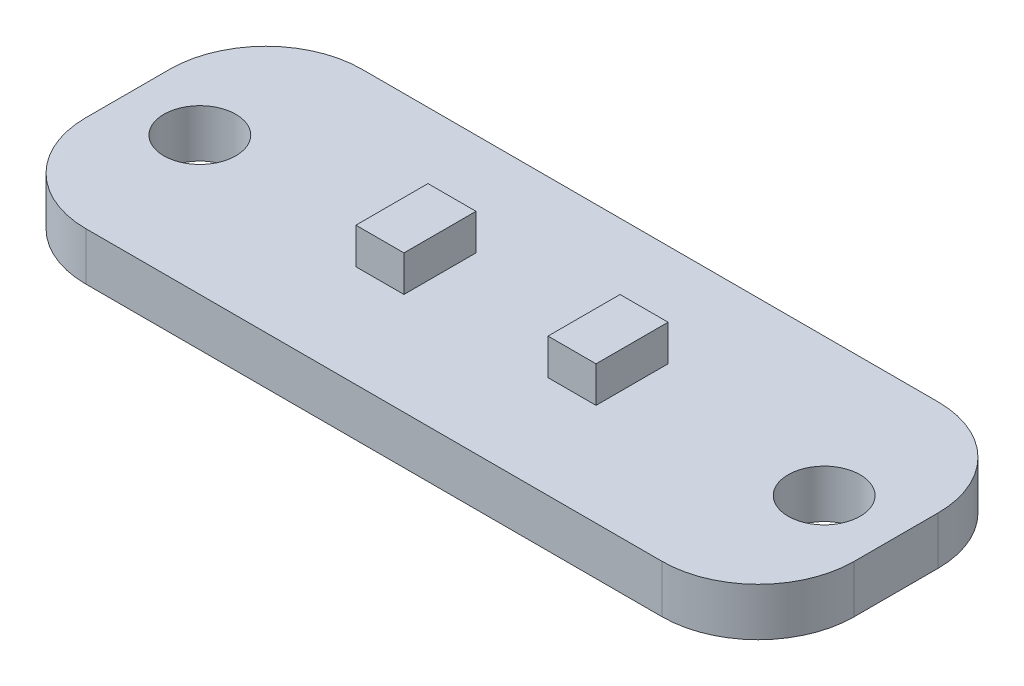
ISO-10303-21;
HEADER;
FILE_DESCRIPTION(('STEP AP214'),'2;1');
FILE_NAME('part.step','',(''),(''),'','','');
FILE_SCHEMA(('AUTOMOTIVE_DESIGN { 1 0 10303 214 1 1 1 1 }'));
ENDSEC;
DATA;
#1=APPLICATION_CONTEXT('core data for automotive mechanical design processes');
#2=APPLICATION_PROTOCOL_DEFINITION('international standard','automotive_design',2000,#1);
#3=PRODUCT_CONTEXT('',#1,'mechanical');
#4=PRODUCT('Part','Part','',(#3));
#5=PRODUCT_RELATED_PRODUCT_CATEGORY('part','',(#4));
#6=PRODUCT_DEFINITION_FORMATION('','',#4);
#7=PRODUCT_DEFINITION_CONTEXT('part definition',#1,'design');
#8=PRODUCT_DEFINITION('design','',#6,#7);
#9=PRODUCT_DEFINITION_SHAPE('','',#8);
#10=(LENGTH_UNIT() NAMED_UNIT(*) SI_UNIT(.MILLI.,.METRE.));
#11=(NAMED_UNIT(*) PLANE_ANGLE_UNIT() SI_UNIT($,.RADIAN.));
#12=(NAMED_UNIT(*) SI_UNIT($,.STERADIAN.) SOLID_ANGLE_UNIT());
#13=UNCERTAINTY_MEASURE_WITH_UNIT(LENGTH_MEASURE(1.E-05),#10,'distance_accuracy_value','');
#14=(GEOMETRIC_REPRESENTATION_CONTEXT(3) GLOBAL_UNCERTAINTY_ASSIGNED_CONTEXT((#13)) GLOBAL_UNIT_ASSIGNED_CONTEXT((#10,
#11,#12)) REPRESENTATION_CONTEXT('',''));
#15=CARTESIAN_POINT('',(0.,0.,0.));
#16=DIRECTION('',(0.,0.,1.));
#17=DIRECTION('',(1.,0.,0.));
#18=AXIS2_PLACEMENT_3D('',#15,#16,#17);
#19=CARTESIAN_POINT('',(0.,2.,0.));
#20=DIRECTION('',(1.,0.,0.));
#21=DIRECTION('',(0.,0.,-1.));
#22=AXIS2_PLACEMENT_3D('',#19,#20,#21);
#23=PLANE('',#22);
#24=DIRECTION('',(0.,0.,1.));
#25=VECTOR('',#24,1.);
#26=CARTESIAN_POINT('',(0.,2.,0.));
#27=LINE('',#26,#25);
#28=CARTESIAN_POINT('',(0.,2.,4.));
#29=VERTEX_POINT('',#28);
#30=CARTESIAN_POINT('',(0.,2.,7.5));
#31=VERTEX_POINT('',#30);
#32=EDGE_CURVE('E224',#29,#31,#27,.T.);
#33=ORIENTED_EDGE('',*,*,#32,.F.);
#34=DIRECTION('',(0.,-1.,0.));
#35=VECTOR('',#34,1.);
#36=CARTESIAN_POINT('',(0.,2.,4.));
#37=LINE('',#36,#35);
#38=CARTESIAN_POINT('',(0.,0.,4.));
#39=VERTEX_POINT('',#38);
#40=EDGE_CURVE('E11',#29,#39,#37,.T.);
#41=ORIENTED_EDGE('',*,*,#40,.T.);
#42=DIRECTION('',(0.,0.,1.));
#43=VECTOR('',#42,1.);
#44=CARTESIAN_POINT('',(0.,0.,0.));
#45=LINE('',#44,#43);
#46=CARTESIAN_POINT('',(0.,0.,7.5));
#47=VERTEX_POINT('',#46);
#48=EDGE_CURVE('E220',#39,#47,#45,.T.);
#49=ORIENTED_EDGE('',*,*,#48,.T.);
#50=DIRECTION('',(0.,-1.,0.));
#51=VECTOR('',#50,1.);
#52=CARTESIAN_POINT('',(0.,2.,7.5));
#53=LINE('',#52,#51);
#54=EDGE_CURVE('E50',#47,#31,#53,.F.);
#55=ORIENTED_EDGE('',*,*,#54,.T.);
#56=EDGE_LOOP('',(#33,#41,#49,#55));
#57=FACE_BOUND('',#56,.T.);
#58=ADVANCED_FACE('F39',(#57),#23,.F.);
#59=CARTESIAN_POINT('',(0.,2.,11.5));
#60=DIRECTION('',(0.,0.,-1.));
#61=DIRECTION('',(-1.,0.,0.));
#62=AXIS2_PLACEMENT_3D('',#59,#60,#61);
#63=PLANE('',#62);
#64=DIRECTION('',(1.,0.,0.));
#65=VECTOR('',#64,1.);
#66=CARTESIAN_POINT('',(0.,0.,11.5));
#67=LINE('',#66,#65);
#68=CARTESIAN_POINT('',(4.,0.,11.5));
#69=VERTEX_POINT('',#68);
#70=CARTESIAN_POINT('',(28.,0.,11.5));
#71=VERTEX_POINT('',#70);
#72=EDGE_CURVE('E239',#69,#71,#67,.T.);
#73=ORIENTED_EDGE('',*,*,#72,.T.);
#74=DIRECTION('',(0.,-1.,0.));
#75=VECTOR('',#74,1.);
#76=CARTESIAN_POINT('',(28.,2.,11.5));
#77=LINE('',#76,#75);
#78=CARTESIAN_POINT('',(28.,2.,11.5));
#79=VERTEX_POINT('',#78);
#80=EDGE_CURVE('E274',#71,#79,#77,.F.);
#81=ORIENTED_EDGE('',*,*,#80,.T.);
#82=DIRECTION('',(1.,0.,0.));
#83=VECTOR('',#82,1.);
#84=CARTESIAN_POINT('',(0.,2.,11.5));
#85=LINE('',#84,#83);
#86=CARTESIAN_POINT('',(4.,2.,11.5));
#87=VERTEX_POINT('',#86);
#88=EDGE_CURVE('E226',#87,#79,#85,.T.);
#89=ORIENTED_EDGE('',*,*,#88,.F.);
#90=DIRECTION('',(0.,-1.,0.));
#91=VECTOR('',#90,1.);
#92=CARTESIAN_POINT('',(4.,2.,11.5));
#93=LINE('',#92,#91);
#94=EDGE_CURVE('E275',#87,#69,#93,.T.);
#95=ORIENTED_EDGE('',*,*,#94,.T.);
#96=EDGE_LOOP('',(#73,#81,#89,#95));
#97=FACE_BOUND('',#96,.T.);
#98=ADVANCED_FACE('F286',(#97),#63,.F.);
#99=CARTESIAN_POINT('',(32.,2.,0.));
#100=DIRECTION('',(-1.,0.,0.));
#101=DIRECTION('',(0.,0.,1.));
#102=AXIS2_PLACEMENT_3D('',#99,#100,#101);
#103=PLANE('',#102);
#104=DIRECTION('',(0.,0.,-1.));
#105=VECTOR('',#104,1.);
#106=CARTESIAN_POINT('',(32.,0.,0.));
#107=LINE('',#106,#105);
#108=CARTESIAN_POINT('',(32.,0.,7.5));
#109=VERTEX_POINT('',#108);
#110=CARTESIAN_POINT('',(32.,0.,4.));
#111=VERTEX_POINT('',#110);
#112=EDGE_CURVE('E245',#109,#111,#107,.T.);
#113=ORIENTED_EDGE('',*,*,#112,.T.);
#114=DIRECTION('',(0.,-1.,0.));
#115=VECTOR('',#114,1.);
#116=CARTESIAN_POINT('',(32.,2.,4.));
#117=LINE('',#116,#115);
#118=CARTESIAN_POINT('',(32.,2.,4.));
#119=VERTEX_POINT('',#118);
#120=EDGE_CURVE('E265',#111,#119,#117,.F.);
#121=ORIENTED_EDGE('',*,*,#120,.T.);
#122=DIRECTION('',(0.,0.,-1.));
#123=VECTOR('',#122,1.);
#124=CARTESIAN_POINT('',(32.,2.,0.));
#125=LINE('',#124,#123);
#126=CARTESIAN_POINT('',(32.,2.,7.5));
#127=VERTEX_POINT('',#126);
#128=EDGE_CURVE('E229',#127,#119,#125,.T.);
#129=ORIENTED_EDGE('',*,*,#128,.F.);
#130=DIRECTION('',(0.,-1.,0.));
#131=VECTOR('',#130,1.);
#132=CARTESIAN_POINT('',(32.,2.,7.5));
#133=LINE('',#132,#131);
#134=EDGE_CURVE('E259',#127,#109,#133,.T.);
#135=ORIENTED_EDGE('',*,*,#134,.T.);
#136=EDGE_LOOP('',(#113,#121,#129,#135));
#137=FACE_BOUND('',#136,.T.);
#138=ADVANCED_FACE('F305',(#137),#103,.F.);
#139=CARTESIAN_POINT('',(0.,2.,0.));
#140=DIRECTION('',(0.,0.,1.));
#141=DIRECTION('',(1.,0.,0.));
#142=AXIS2_PLACEMENT_3D('',#139,#140,#141);
#143=PLANE('',#142);
#144=DIRECTION('',(-1.,0.,0.));
#145=VECTOR('',#144,1.);
#146=CARTESIAN_POINT('',(0.,2.,0.));
#147=LINE('',#146,#145);
#148=CARTESIAN_POINT('',(28.,2.,0.));
#149=VERTEX_POINT('',#148);
#150=CARTESIAN_POINT('',(4.,2.,0.));
#151=VERTEX_POINT('',#150);
#152=EDGE_CURVE('E233',#149,#151,#147,.T.);
#153=ORIENTED_EDGE('',*,*,#152,.F.);
#154=DIRECTION('',(0.,-1.,0.));
#155=VECTOR('',#154,1.);
#156=CARTESIAN_POINT('',(28.,2.,0.));
#157=LINE('',#156,#155);
#158=CARTESIAN_POINT('',(28.,0.,0.));
#159=VERTEX_POINT('',#158);
#160=EDGE_CURVE('E248',#149,#159,#157,.T.);
#161=ORIENTED_EDGE('',*,*,#160,.T.);
#162=DIRECTION('',(-1.,0.,0.));
#163=VECTOR('',#162,1.);
#164=CARTESIAN_POINT('',(0.,0.,0.));
#165=LINE('',#164,#163);
#166=CARTESIAN_POINT('',(4.,0.,0.));
#167=VERTEX_POINT('',#166);
#168=EDGE_CURVE('E230',#159,#167,#165,.T.);
#169=ORIENTED_EDGE('',*,*,#168,.T.);
#170=DIRECTION('',(0.,-1.,0.));
#171=VECTOR('',#170,1.);
#172=CARTESIAN_POINT('',(4.,2.,0.));
#173=LINE('',#172,#171);
#174=EDGE_CURVE('E237',#167,#151,#173,.F.);
#175=ORIENTED_EDGE('',*,*,#174,.T.);
#176=EDGE_LOOP('',(#153,#161,#169,#175));
#177=FACE_BOUND('',#176,.T.);
#178=ADVANCED_FACE('F309',(#177),#143,.F.);
#179=CARTESIAN_POINT('',(0.,2.,0.));
#180=DIRECTION('',(0.,1.,0.));
#181=DIRECTION('',(0.,0.,1.));
#182=AXIS2_PLACEMENT_3D('',#179,#180,#181);
#183=PLANE('',#182);
#184=DIRECTION('',(0.,0.,1.));
#185=VECTOR('',#184,1.);
#186=CARTESIAN_POINT('',(11.,2.,4.25));
#187=LINE('',#186,#185);
#188=CARTESIAN_POINT('',(11.,2.,4.25));
#189=VERTEX_POINT('',#188);
#190=CARTESIAN_POINT('',(11.,2.,7.25));
#191=VERTEX_POINT('',#190);
#192=EDGE_CURVE('E53',#189,#191,#187,.T.);
#193=ORIENTED_EDGE('',*,*,#192,.F.);
#194=DIRECTION('',(-1.,0.,0.));
#195=VECTOR('',#194,1.);
#196=CARTESIAN_POINT('',(11.,2.,4.25));
#197=LINE('',#196,#195);
#198=CARTESIAN_POINT('',(13.,2.,4.25));
#199=VERTEX_POINT('',#198);
#200=EDGE_CURVE('E59',#199,#189,#197,.T.);
#201=ORIENTED_EDGE('',*,*,#200,.F.);
#202=DIRECTION('',(0.,0.,-1.));
#203=VECTOR('',#202,1.);
#204=CARTESIAN_POINT('',(13.,2.,4.25));
#205=LINE('',#204,#203);
#206=CARTESIAN_POINT('',(13.,2.,7.25));
#207=VERTEX_POINT('',#206);
#208=EDGE_CURVE('E498',#207,#199,#205,.T.);
#209=ORIENTED_EDGE('',*,*,#208,.F.);
#210=DIRECTION('',(1.,0.,0.));
#211=VECTOR('',#210,1.);
#212=CARTESIAN_POINT('',(11.,2.,7.25));
#213=LINE('',#212,#211);
#214=EDGE_CURVE('E507',#191,#207,#213,.T.);
#215=ORIENTED_EDGE('',*,*,#214,.F.);
#216=EDGE_LOOP('',(#193,#201,#209,#215));
#217=FACE_BOUND('',#216,.T.);
#218=DIRECTION('',(0.,0.,1.));
#219=VECTOR('',#218,1.);
#220=CARTESIAN_POINT('',(19.,2.,4.25));
#221=LINE('',#220,#219);
#222=CARTESIAN_POINT('',(19.,2.,4.25));
#223=VERTEX_POINT('',#222);
#224=CARTESIAN_POINT('',(19.,2.,7.25));
#225=VERTEX_POINT('',#224);
#226=EDGE_CURVE('E204',#223,#225,#221,.T.);
#227=ORIENTED_EDGE('',*,*,#226,.F.);
#228=DIRECTION('',(-1.,0.,0.));
#229=VECTOR('',#228,1.);
#230=CARTESIAN_POINT('',(19.,2.,4.25));
#231=LINE('',#230,#229);
#232=CARTESIAN_POINT('',(21.,2.,4.25));
#233=VERTEX_POINT('',#232);
#234=EDGE_CURVE('E194',#233,#223,#231,.T.);
#235=ORIENTED_EDGE('',*,*,#234,.F.);
#236=DIRECTION('',(0.,0.,-1.));
#237=VECTOR('',#236,1.);
#238=CARTESIAN_POINT('',(21.,2.,4.25));
#239=LINE('',#238,#237);
#240=CARTESIAN_POINT('',(21.,2.,7.25));
#241=VERTEX_POINT('',#240);
#242=EDGE_CURVE('E197',#241,#233,#239,.T.);
#243=ORIENTED_EDGE('',*,*,#242,.F.);
#244=DIRECTION('',(1.,0.,0.));
#245=VECTOR('',#244,1.);
#246=CARTESIAN_POINT('',(19.,2.,7.25));
#247=LINE('',#246,#245);
#248=EDGE_CURVE('E203',#225,#241,#247,.T.);
#249=ORIENTED_EDGE('',*,*,#248,.F.);
#250=EDGE_LOOP('',(#227,#235,#243,#249));
#251=FACE_BOUND('',#250,.T.);
#252=CARTESIAN_POINT('',(3.,2.,5.75));
#253=DIRECTION('',(0.,1.,0.));
#254=DIRECTION('',(0.,0.,1.));
#255=AXIS2_PLACEMENT_3D('',#252,#253,#254);
#256=CIRCLE('',#255,1.5);
#257=CARTESIAN_POINT('',(3.,2.,7.25));
#258=VERTEX_POINT('',#257);
#259=EDGE_CURVE('E217',#258,#258,#256,.T.);
#260=ORIENTED_EDGE('',*,*,#259,.F.);
#261=EDGE_LOOP('',(#260));
#262=FACE_BOUND('',#261,.T.);
#263=CARTESIAN_POINT('',(29.,2.,5.75));
#264=DIRECTION('',(0.,1.,0.));
#265=DIRECTION('',(0.,0.,1.));
#266=AXIS2_PLACEMENT_3D('',#263,#264,#265);
#267=CIRCLE('',#266,1.5);
#268=CARTESIAN_POINT('',(29.,2.,7.25));
#269=VERTEX_POINT('',#268);
#270=EDGE_CURVE('E174',#269,#269,#267,.T.);
#271=ORIENTED_EDGE('',*,*,#270,.F.);
#272=EDGE_LOOP('',(#271));
#273=FACE_BOUND('',#272,.T.);
#274=ORIENTED_EDGE('',*,*,#128,.T.);
#275=CARTESIAN_POINT('',(28.,2.,4.));
#276=DIRECTION('',(0.,1.,0.));
#277=DIRECTION('',(0.,0.,1.));
#278=AXIS2_PLACEMENT_3D('',#275,#276,#277);
#279=CIRCLE('',#278,4.);
#280=EDGE_CURVE('E269',#119,#149,#279,.T.);
#281=ORIENTED_EDGE('',*,*,#280,.T.);
#282=ORIENTED_EDGE('',*,*,#152,.T.);
#283=CARTESIAN_POINT('',(4.,2.,4.));
#284=DIRECTION('',(0.,1.,0.));
#285=DIRECTION('',(0.,0.,1.));
#286=AXIS2_PLACEMENT_3D('',#283,#284,#285);
#287=CIRCLE('',#286,4.);
#288=EDGE_CURVE('E266',#151,#29,#287,.T.);
#289=ORIENTED_EDGE('',*,*,#288,.T.);
#290=ORIENTED_EDGE('',*,*,#32,.T.);
#291=CARTESIAN_POINT('',(4.,2.,7.5));
#292=DIRECTION('',(0.,1.,0.));
#293=DIRECTION('',(0.,0.,1.));
#294=AXIS2_PLACEMENT_3D('',#291,#292,#293);
#295=CIRCLE('',#294,4.);
#296=EDGE_CURVE('E262',#31,#87,#295,.T.);
#297=ORIENTED_EDGE('',*,*,#296,.T.);
#298=ORIENTED_EDGE('',*,*,#88,.T.);
#299=CARTESIAN_POINT('',(28.,2.,7.5));
#300=DIRECTION('',(0.,1.,0.));
#301=DIRECTION('',(0.,0.,1.));
#302=AXIS2_PLACEMENT_3D('',#299,#300,#301);
#303=CIRCLE('',#302,4.);
#304=EDGE_CURVE('E268',#79,#127,#303,.T.);
#305=ORIENTED_EDGE('',*,*,#304,.T.);
#306=EDGE_LOOP('',(#274,#281,#282,#289,#290,#297,#298,#305));
#307=FACE_BOUND('',#306,.T.);
#308=ADVANCED_FACE('F283',(#217,#251,#262,#273,#307),#183,.T.);
#309=CARTESIAN_POINT('',(0.,0.,0.));
#310=DIRECTION('',(0.,1.,0.));
#311=DIRECTION('',(0.,0.,1.));
#312=AXIS2_PLACEMENT_3D('',#309,#310,#311);
#313=PLANE('',#312);
#314=CARTESIAN_POINT('',(3.,0.,5.75));
#315=DIRECTION('',(0.,1.,0.));
#316=DIRECTION('',(0.,0.,1.));
#317=AXIS2_PLACEMENT_3D('',#314,#315,#316);
#318=CIRCLE('',#317,1.5);
#319=CARTESIAN_POINT('',(3.,0.,7.25));
#320=VERTEX_POINT('',#319);
#321=EDGE_CURVE('E212',#320,#320,#318,.T.);
#322=ORIENTED_EDGE('',*,*,#321,.T.);
#323=EDGE_LOOP('',(#322));
#324=FACE_BOUND('',#323,.T.);
#325=CARTESIAN_POINT('',(29.,0.,5.75));
#326=DIRECTION('',(0.,1.,0.));
#327=DIRECTION('',(0.,0.,1.));
#328=AXIS2_PLACEMENT_3D('',#325,#326,#327);
#329=CIRCLE('',#328,1.5);
#330=CARTESIAN_POINT('',(29.,0.,7.25));
#331=VERTEX_POINT('',#330);
#332=EDGE_CURVE('E175',#331,#331,#329,.T.);
#333=ORIENTED_EDGE('',*,*,#332,.T.);
#334=EDGE_LOOP('',(#333));
#335=FACE_BOUND('',#334,.T.);
#336=ORIENTED_EDGE('',*,*,#168,.F.);
#337=CARTESIAN_POINT('',(28.,0.,4.));
#338=DIRECTION('',(0.,1.,0.));
#339=DIRECTION('',(0.,0.,1.));
#340=AXIS2_PLACEMENT_3D('',#337,#338,#339);
#341=CIRCLE('',#340,4.);
#342=EDGE_CURVE('E260',#159,#111,#341,.F.);
#343=ORIENTED_EDGE('',*,*,#342,.T.);
#344=ORIENTED_EDGE('',*,*,#112,.F.);
#345=CARTESIAN_POINT('',(28.,0.,7.5));
#346=DIRECTION('',(0.,1.,0.));
#347=DIRECTION('',(0.,0.,1.));
#348=AXIS2_PLACEMENT_3D('',#345,#346,#347);
#349=CIRCLE('',#348,4.);
#350=EDGE_CURVE('E254',#109,#71,#349,.F.);
#351=ORIENTED_EDGE('',*,*,#350,.T.);
#352=ORIENTED_EDGE('',*,*,#72,.F.);
#353=CARTESIAN_POINT('',(4.,0.,7.5));
#354=DIRECTION('',(0.,1.,0.));
#355=DIRECTION('',(0.,0.,1.));
#356=AXIS2_PLACEMENT_3D('',#353,#354,#355);
#357=CIRCLE('',#356,4.);
#358=EDGE_CURVE('E253',#69,#47,#357,.F.);
#359=ORIENTED_EDGE('',*,*,#358,.T.);
#360=ORIENTED_EDGE('',*,*,#48,.F.);
#361=CARTESIAN_POINT('',(4.,0.,4.));
#362=DIRECTION('',(0.,1.,0.));
#363=DIRECTION('',(0.,0.,1.));
#364=AXIS2_PLACEMENT_3D('',#361,#362,#363);
#365=CIRCLE('',#364,4.);
#366=EDGE_CURVE('E251',#39,#167,#365,.F.);
#367=ORIENTED_EDGE('',*,*,#366,.T.);
#368=EDGE_LOOP('',(#336,#343,#344,#351,#352,#359,#360,#367));
#369=FACE_BOUND('',#368,.T.);
#370=ADVANCED_FACE('F294',(#324,#335,#369),#313,.F.);
#371=CARTESIAN_POINT('',(29.,0.,5.75));
#372=DIRECTION('',(0.,1.,0.));
#373=DIRECTION('',(0.,0.,1.));
#374=AXIS2_PLACEMENT_3D('',#371,#372,#373);
#375=CYLINDRICAL_SURFACE('',#374,1.5);
#376=ORIENTED_EDGE('',*,*,#332,.F.);
#377=EDGE_LOOP('',(#376));
#378=FACE_BOUND('',#377,.T.);
#379=ORIENTED_EDGE('',*,*,#270,.T.);
#380=EDGE_LOOP('',(#379));
#381=FACE_BOUND('',#380,.T.);
#382=ADVANCED_FACE('F333',(#378,#381),#375,.F.);
#383=CARTESIAN_POINT('',(3.,0.,5.75));
#384=DIRECTION('',(0.,1.,0.));
#385=DIRECTION('',(0.,0.,1.));
#386=AXIS2_PLACEMENT_3D('',#383,#384,#385);
#387=CYLINDRICAL_SURFACE('',#386,1.5);
#388=ORIENTED_EDGE('',*,*,#321,.F.);
#389=EDGE_LOOP('',(#388));
#390=FACE_BOUND('',#389,.T.);
#391=ORIENTED_EDGE('',*,*,#259,.T.);
#392=EDGE_LOOP('',(#391));
#393=FACE_BOUND('',#392,.T.);
#394=ADVANCED_FACE('F332',(#390,#393),#387,.F.);
#395=CARTESIAN_POINT('',(28.,2.,4.));
#396=DIRECTION('',(0.,-1.,0.));
#397=DIRECTION('',(0.,0.,-1.));
#398=AXIS2_PLACEMENT_3D('',#395,#396,#397);
#399=CYLINDRICAL_SURFACE('',#398,4.);
#400=ORIENTED_EDGE('',*,*,#280,.F.);
#401=ORIENTED_EDGE('',*,*,#120,.F.);
#402=ORIENTED_EDGE('',*,*,#342,.F.);
#403=ORIENTED_EDGE('',*,*,#160,.F.);
#404=EDGE_LOOP('',(#400,#401,#402,#403));
#405=FACE_BOUND('',#404,.T.);
#406=ADVANCED_FACE('F306',(#405),#399,.T.);
#407=CARTESIAN_POINT('',(28.,2.,7.5));
#408=DIRECTION('',(0.,-1.,0.));
#409=DIRECTION('',(0.,0.,-1.));
#410=AXIS2_PLACEMENT_3D('',#407,#408,#409);
#411=CYLINDRICAL_SURFACE('',#410,4.);
#412=ORIENTED_EDGE('',*,*,#304,.F.);
#413=ORIENTED_EDGE('',*,*,#80,.F.);
#414=ORIENTED_EDGE('',*,*,#350,.F.);
#415=ORIENTED_EDGE('',*,*,#134,.F.);
#416=EDGE_LOOP('',(#412,#413,#414,#415));
#417=FACE_BOUND('',#416,.T.);
#418=ADVANCED_FACE('F298',(#417),#411,.T.);
#419=CARTESIAN_POINT('',(4.,2.,4.));
#420=DIRECTION('',(0.,-1.,0.));
#421=DIRECTION('',(0.,0.,-1.));
#422=AXIS2_PLACEMENT_3D('',#419,#420,#421);
#423=CYLINDRICAL_SURFACE('',#422,4.);
#424=ORIENTED_EDGE('',*,*,#288,.F.);
#425=ORIENTED_EDGE('',*,*,#174,.F.);
#426=ORIENTED_EDGE('',*,*,#366,.F.);
#427=ORIENTED_EDGE('',*,*,#40,.F.);
#428=EDGE_LOOP('',(#424,#425,#426,#427));
#429=FACE_BOUND('',#428,.T.);
#430=ADVANCED_FACE('F311',(#429),#423,.T.);
#431=CARTESIAN_POINT('',(4.,2.,7.5));
#432=DIRECTION('',(0.,-1.,0.));
#433=DIRECTION('',(0.,0.,-1.));
#434=AXIS2_PLACEMENT_3D('',#431,#432,#433);
#435=CYLINDRICAL_SURFACE('',#434,4.);
#436=ORIENTED_EDGE('',*,*,#296,.F.);
#437=ORIENTED_EDGE('',*,*,#54,.F.);
#438=ORIENTED_EDGE('',*,*,#358,.F.);
#439=ORIENTED_EDGE('',*,*,#94,.F.);
#440=EDGE_LOOP('',(#436,#437,#438,#439));
#441=FACE_BOUND('',#440,.T.);
#442=ADVANCED_FACE('F41',(#441),#435,.T.);
#443=CARTESIAN_POINT('',(19.,3.5,4.25));
#444=DIRECTION('',(1.,0.,0.));
#445=DIRECTION('',(0.,0.,-1.));
#446=AXIS2_PLACEMENT_3D('',#443,#444,#445);
#447=PLANE('',#446);
#448=ORIENTED_EDGE('',*,*,#226,.T.);
#449=DIRECTION('',(0.,-1.,0.));
#450=VECTOR('',#449,1.);
#451=CARTESIAN_POINT('',(19.,3.5,7.25));
#452=LINE('',#451,#450);
#453=CARTESIAN_POINT('',(19.,3.5,7.25));
#454=VERTEX_POINT('',#453);
#455=EDGE_CURVE('E182',#454,#225,#452,.T.);
#456=ORIENTED_EDGE('',*,*,#455,.F.);
#457=DIRECTION('',(0.,0.,1.));
#458=VECTOR('',#457,1.);
#459=CARTESIAN_POINT('',(19.,3.5,4.25));
#460=LINE('',#459,#458);
#461=CARTESIAN_POINT('',(19.,3.5,4.25));
#462=VERTEX_POINT('',#461);
#463=EDGE_CURVE('E196',#462,#454,#460,.T.);
#464=ORIENTED_EDGE('',*,*,#463,.F.);
#465=DIRECTION('',(0.,-1.,0.));
#466=VECTOR('',#465,1.);
#467=CARTESIAN_POINT('',(19.,3.5,4.25));
#468=LINE('',#467,#466);
#469=EDGE_CURVE('E189',#462,#223,#468,.T.);
#470=ORIENTED_EDGE('',*,*,#469,.T.);
#471=EDGE_LOOP('',(#448,#456,#464,#470));
#472=FACE_BOUND('',#471,.T.);
#473=ADVANCED_FACE('F317',(#472),#447,.F.);
#474=CARTESIAN_POINT('',(19.,3.5,7.25));
#475=DIRECTION('',(0.,0.,-1.));
#476=DIRECTION('',(-1.,0.,0.));
#477=AXIS2_PLACEMENT_3D('',#474,#475,#476);
#478=PLANE('',#477);
#479=ORIENTED_EDGE('',*,*,#248,.T.);
#480=DIRECTION('',(0.,-1.,0.));
#481=VECTOR('',#480,1.);
#482=CARTESIAN_POINT('',(21.,3.5,7.25));
#483=LINE('',#482,#481);
#484=CARTESIAN_POINT('',(21.,3.5,7.25));
#485=VERTEX_POINT('',#484);
#486=EDGE_CURVE('E184',#485,#241,#483,.T.);
#487=ORIENTED_EDGE('',*,*,#486,.F.);
#488=DIRECTION('',(1.,0.,0.));
#489=VECTOR('',#488,1.);
#490=CARTESIAN_POINT('',(19.,3.5,7.25));
#491=LINE('',#490,#489);
#492=EDGE_CURVE('E209',#454,#485,#491,.T.);
#493=ORIENTED_EDGE('',*,*,#492,.F.);
#494=ORIENTED_EDGE('',*,*,#455,.T.);
#495=EDGE_LOOP('',(#479,#487,#493,#494));
#496=FACE_BOUND('',#495,.T.);
#497=ADVANCED_FACE('F413',(#496),#478,.F.);
#498=CARTESIAN_POINT('',(21.,3.5,4.25));
#499=DIRECTION('',(-1.,0.,0.));
#500=DIRECTION('',(0.,0.,1.));
#501=AXIS2_PLACEMENT_3D('',#498,#499,#500);
#502=PLANE('',#501);
#503=ORIENTED_EDGE('',*,*,#242,.T.);
#504=DIRECTION('',(0.,-1.,0.));
#505=VECTOR('',#504,1.);
#506=CARTESIAN_POINT('',(21.,3.5,4.25));
#507=LINE('',#506,#505);
#508=CARTESIAN_POINT('',(21.,3.5,4.25));
#509=VERTEX_POINT('',#508);
#510=EDGE_CURVE('E190',#509,#233,#507,.T.);
#511=ORIENTED_EDGE('',*,*,#510,.F.);
#512=DIRECTION('',(0.,0.,-1.));
#513=VECTOR('',#512,1.);
#514=CARTESIAN_POINT('',(21.,3.5,4.25));
#515=LINE('',#514,#513);
#516=EDGE_CURVE('E208',#485,#509,#515,.T.);
#517=ORIENTED_EDGE('',*,*,#516,.F.);
#518=ORIENTED_EDGE('',*,*,#486,.T.);
#519=EDGE_LOOP('',(#503,#511,#517,#518));
#520=FACE_BOUND('',#519,.T.);
#521=ADVANCED_FACE('F421',(#520),#502,.F.);
#522=CARTESIAN_POINT('',(19.,3.5,4.25));
#523=DIRECTION('',(0.,0.,1.));
#524=DIRECTION('',(1.,0.,0.));
#525=AXIS2_PLACEMENT_3D('',#522,#523,#524);
#526=PLANE('',#525);
#527=ORIENTED_EDGE('',*,*,#234,.T.);
#528=ORIENTED_EDGE('',*,*,#469,.F.);
#529=DIRECTION('',(-1.,0.,0.));
#530=VECTOR('',#529,1.);
#531=CARTESIAN_POINT('',(19.,3.5,4.25));
#532=LINE('',#531,#530);
#533=EDGE_CURVE('E193',#509,#462,#532,.T.);
#534=ORIENTED_EDGE('',*,*,#533,.F.);
#535=ORIENTED_EDGE('',*,*,#510,.T.);
#536=EDGE_LOOP('',(#527,#528,#534,#535));
#537=FACE_BOUND('',#536,.T.);
#538=ADVANCED_FACE('F433',(#537),#526,.F.);
#539=CARTESIAN_POINT('',(0.,3.5,0.));
#540=DIRECTION('',(0.,1.,0.));
#541=DIRECTION('',(0.,0.,1.));
#542=AXIS2_PLACEMENT_3D('',#539,#540,#541);
#543=PLANE('',#542);
#544=ORIENTED_EDGE('',*,*,#463,.T.);
#545=ORIENTED_EDGE('',*,*,#492,.T.);
#546=ORIENTED_EDGE('',*,*,#516,.T.);
#547=ORIENTED_EDGE('',*,*,#533,.T.);
#548=EDGE_LOOP('',(#544,#545,#546,#547));
#549=FACE_BOUND('',#548,.T.);
#550=ADVANCED_FACE('F347',(#549),#543,.T.);
#551=CARTESIAN_POINT('',(11.,3.5,4.25));
#552=DIRECTION('',(1.,0.,0.));
#553=DIRECTION('',(0.,0.,-1.));
#554=AXIS2_PLACEMENT_3D('',#551,#552,#553);
#555=PLANE('',#554);
#556=ORIENTED_EDGE('',*,*,#192,.T.);
#557=DIRECTION('',(0.,-1.,0.));
#558=VECTOR('',#557,1.);
#559=CARTESIAN_POINT('',(11.,3.5,7.25));
#560=LINE('',#559,#558);
#561=CARTESIAN_POINT('',(11.,3.5,7.25));
#562=VERTEX_POINT('',#561);
#563=EDGE_CURVE('E154',#562,#191,#560,.T.);
#564=ORIENTED_EDGE('',*,*,#563,.F.);
#565=DIRECTION('',(0.,0.,1.));
#566=VECTOR('',#565,1.);
#567=CARTESIAN_POINT('',(11.,3.5,4.25));
#568=LINE('',#567,#566);
#569=CARTESIAN_POINT('',(11.,3.5,4.25));
#570=VERTEX_POINT('',#569);
#571=EDGE_CURVE('E161',#570,#562,#568,.T.);
#572=ORIENTED_EDGE('',*,*,#571,.F.);
#573=DIRECTION('',(0.,-1.,0.));
#574=VECTOR('',#573,1.);
#575=CARTESIAN_POINT('',(11.,3.5,4.25));
#576=LINE('',#575,#574);
#577=EDGE_CURVE('E499',#570,#189,#576,.T.);
#578=ORIENTED_EDGE('',*,*,#577,.T.);
#579=EDGE_LOOP('',(#556,#564,#572,#578));
#580=FACE_BOUND('',#579,.T.);
#581=ADVANCED_FACE('F171',(#580),#555,.F.);
#582=CARTESIAN_POINT('',(11.,3.5,7.25));
#583=DIRECTION('',(0.,0.,-1.));
#584=DIRECTION('',(-1.,0.,0.));
#585=AXIS2_PLACEMENT_3D('',#582,#583,#584);
#586=PLANE('',#585);
#587=ORIENTED_EDGE('',*,*,#214,.T.);
#588=DIRECTION('',(0.,-1.,0.));
#589=VECTOR('',#588,1.);
#590=CARTESIAN_POINT('',(13.,3.5,7.25));
#591=LINE('',#590,#589);
#592=CARTESIAN_POINT('',(13.,3.5,7.25));
#593=VERTEX_POINT('',#592);
#594=EDGE_CURVE('E160',#593,#207,#591,.T.);
#595=ORIENTED_EDGE('',*,*,#594,.F.);
#596=DIRECTION('',(1.,0.,0.));
#597=VECTOR('',#596,1.);
#598=CARTESIAN_POINT('',(11.,3.5,7.25));
#599=LINE('',#598,#597);
#600=EDGE_CURVE('E147',#562,#593,#599,.T.);
#601=ORIENTED_EDGE('',*,*,#600,.F.);
#602=ORIENTED_EDGE('',*,*,#563,.T.);
#603=EDGE_LOOP('',(#587,#595,#601,#602));
#604=FACE_BOUND('',#603,.T.);
#605=ADVANCED_FACE('F153',(#604),#586,.F.);
#606=CARTESIAN_POINT('',(13.,3.5,4.25));
#607=DIRECTION('',(-1.,0.,0.));
#608=DIRECTION('',(0.,0.,1.));
#609=AXIS2_PLACEMENT_3D('',#606,#607,#608);
#610=PLANE('',#609);
#611=ORIENTED_EDGE('',*,*,#208,.T.);
#612=DIRECTION('',(0.,-1.,0.));
#613=VECTOR('',#612,1.);
#614=CARTESIAN_POINT('',(13.,3.5,4.25));
#615=LINE('',#614,#613);
#616=CARTESIAN_POINT('',(13.,3.5,4.25));
#617=VERTEX_POINT('',#616);
#618=EDGE_CURVE('E180',#617,#199,#615,.T.);
#619=ORIENTED_EDGE('',*,*,#618,.F.);
#620=DIRECTION('',(0.,0.,-1.));
#621=VECTOR('',#620,1.);
#622=CARTESIAN_POINT('',(13.,3.5,4.25));
#623=LINE('',#622,#621);
#624=EDGE_CURVE('E159',#593,#617,#623,.T.);
#625=ORIENTED_EDGE('',*,*,#624,.F.);
#626=ORIENTED_EDGE('',*,*,#594,.T.);
#627=EDGE_LOOP('',(#611,#619,#625,#626));
#628=FACE_BOUND('',#627,.T.);
#629=ADVANCED_FACE('F470',(#628),#610,.F.);
#630=CARTESIAN_POINT('',(11.,3.5,4.25));
#631=DIRECTION('',(0.,0.,1.));
#632=DIRECTION('',(1.,0.,0.));
#633=AXIS2_PLACEMENT_3D('',#630,#631,#632);
#634=PLANE('',#633);
#635=ORIENTED_EDGE('',*,*,#200,.T.);
#636=ORIENTED_EDGE('',*,*,#577,.F.);
#637=DIRECTION('',(-1.,0.,0.));
#638=VECTOR('',#637,1.);
#639=CARTESIAN_POINT('',(11.,3.5,4.25));
#640=LINE('',#639,#638);
#641=EDGE_CURVE('E167',#617,#570,#640,.T.);
#642=ORIENTED_EDGE('',*,*,#641,.F.);
#643=ORIENTED_EDGE('',*,*,#618,.T.);
#644=EDGE_LOOP('',(#635,#636,#642,#643));
#645=FACE_BOUND('',#644,.T.);
#646=ADVANCED_FACE('F478',(#645),#634,.F.);
#647=CARTESIAN_POINT('',(0.,3.5,0.));
#648=DIRECTION('',(0.,1.,0.));
#649=DIRECTION('',(0.,0.,1.));
#650=AXIS2_PLACEMENT_3D('',#647,#648,#649);
#651=PLANE('',#650);
#652=ORIENTED_EDGE('',*,*,#571,.T.);
#653=ORIENTED_EDGE('',*,*,#600,.T.);
#654=ORIENTED_EDGE('',*,*,#624,.T.);
#655=ORIENTED_EDGE('',*,*,#641,.T.);
#656=EDGE_LOOP('',(#652,#653,#654,#655));
#657=FACE_BOUND('',#656,.T.);
#658=ADVANCED_FACE('F163',(#657),#651,.T.);
#659=CLOSED_SHELL('',(#58,#98,#138,#178,#308,#370,#382,#394,#406,#418,#430,#442,#473,#497,#521,
#538,#550,#581,#605,#629,#646,#658));
#660=MANIFOLD_SOLID_BREP('B2',#659);
#661=ADVANCED_BREP_SHAPE_REPRESENTATION('',(#18,#660),#14);
#662=SHAPE_DEFINITION_REPRESENTATION(#9,#661);
ENDSEC;
END-ISO-10303-21;
